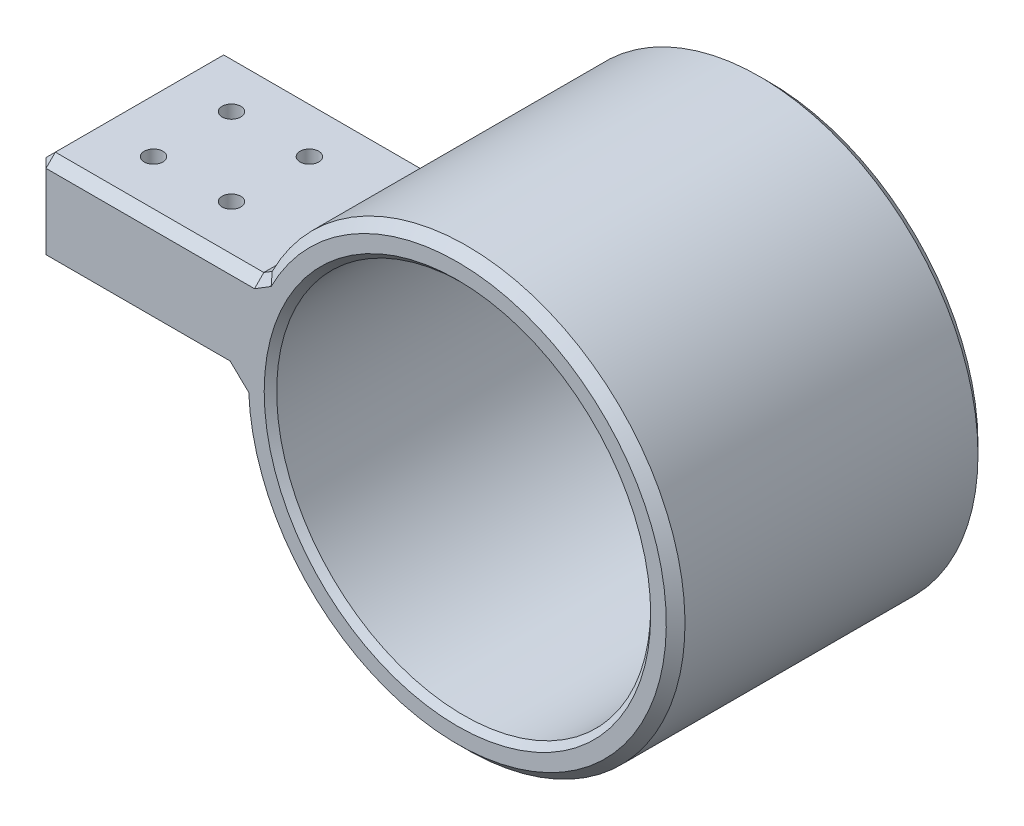
ISO-10303-21;
HEADER;
FILE_DESCRIPTION(('STEP AP214'),'2;1');
FILE_NAME('part.step','',(''),(''),'','','');
FILE_SCHEMA(('AUTOMOTIVE_DESIGN { 1 0 10303 214 1 1 1 1 }'));
ENDSEC;
DATA;
#1=APPLICATION_CONTEXT('core data for automotive mechanical design processes');
#2=APPLICATION_PROTOCOL_DEFINITION('international standard','automotive_design',2000,#1);
#3=PRODUCT_CONTEXT('',#1,'mechanical');
#4=PRODUCT('Part','Part','',(#3));
#5=PRODUCT_RELATED_PRODUCT_CATEGORY('part','',(#4));
#6=PRODUCT_DEFINITION_FORMATION('','',#4);
#7=PRODUCT_DEFINITION_CONTEXT('part definition',#1,'design');
#8=PRODUCT_DEFINITION('design','',#6,#7);
#9=PRODUCT_DEFINITION_SHAPE('','',#8);
#10=(LENGTH_UNIT() NAMED_UNIT(*) SI_UNIT(.MILLI.,.METRE.));
#11=(NAMED_UNIT(*) PLANE_ANGLE_UNIT() SI_UNIT($,.RADIAN.));
#12=(NAMED_UNIT(*) SI_UNIT($,.STERADIAN.) SOLID_ANGLE_UNIT());
#13=UNCERTAINTY_MEASURE_WITH_UNIT(LENGTH_MEASURE(1.E-05),#10,'distance_accuracy_value','');
#14=(GEOMETRIC_REPRESENTATION_CONTEXT(3) GLOBAL_UNCERTAINTY_ASSIGNED_CONTEXT((#13)) GLOBAL_UNIT_ASSIGNED_CONTEXT((#10,
#11,#12)) REPRESENTATION_CONTEXT('',''));
#15=CARTESIAN_POINT('',(0.,0.,0.));
#16=DIRECTION('',(0.,0.,1.));
#17=DIRECTION('',(1.,0.,0.));
#18=AXIS2_PLACEMENT_3D('',#15,#16,#17);
#19=CARTESIAN_POINT('',(0.,0.,-50.));
#20=DIRECTION('',(0.,0.,1.));
#21=DIRECTION('',(-1.,0.,0.));
#22=AXIS2_PLACEMENT_3D('',#19,#20,#21);
#23=CYLINDRICAL_SURFACE('',#22,35.);
#24=CARTESIAN_POINT('',(0.,0.,-48.5));
#25=DIRECTION('',(0.,0.,1.));
#26=DIRECTION('',(1.,0.,0.));
#27=AXIS2_PLACEMENT_3D('',#24,#25,#26);
#28=CIRCLE('',#27,35.);
#29=CARTESIAN_POINT('',(35.,0.,-48.5));
#30=VERTEX_POINT('',#29);
#31=EDGE_CURVE('E172',#30,#30,#28,.F.);
#32=ORIENTED_EDGE('',*,*,#31,.F.);
#33=EDGE_LOOP('',(#32));
#34=FACE_BOUND('',#33,.T.);
#35=DIRECTION('',(0.,0.,1.));
#36=VECTOR('',#35,1.);
#37=CARTESIAN_POINT('',(-31.2196559377255,15.8219178082192,-50.));
#38=LINE('',#37,#36);
#39=CARTESIAN_POINT('',(-31.2196559377255,15.8219178082192,-1.5));
#40=VERTEX_POINT('',#39);
#41=CARTESIAN_POINT('',(-31.2196559377255,15.8219178082192,-28.5));
#42=VERTEX_POINT('',#41);
#43=EDGE_CURVE('E162',#40,#42,#38,.F.);
#44=ORIENTED_EDGE('',*,*,#43,.F.);
#45=CARTESIAN_POINT('',(0.,0.,-1.5));
#46=DIRECTION('',(0.,0.,1.));
#47=DIRECTION('',(1.,0.,0.));
#48=AXIS2_PLACEMENT_3D('',#45,#46,#47);
#49=CIRCLE('',#48,35.);
#50=CARTESIAN_POINT('',(-34.9704322470338,-1.43835616438356,-1.5));
#51=VERTEX_POINT('',#50);
#52=EDGE_CURVE('E135',#51,#40,#49,.T.);
#53=ORIENTED_EDGE('',*,*,#52,.F.);
#54=DIRECTION('',(0.,0.,1.));
#55=VECTOR('',#54,1.);
#56=CARTESIAN_POINT('',(-34.9704322470338,-1.43835616438355,-50.));
#57=LINE('',#56,#55);
#58=CARTESIAN_POINT('',(-34.9704322470338,-1.43835616438356,-31.5));
#59=VERTEX_POINT('',#58);
#60=EDGE_CURVE('E154',#59,#51,#57,.T.);
#61=ORIENTED_EDGE('',*,*,#60,.F.);
#62=CARTESIAN_POINT('',(0.,0.,-31.5));
#63=DIRECTION('',(0.,0.,1.));
#64=DIRECTION('',(1.,0.,0.));
#65=AXIS2_PLACEMENT_3D('',#62,#63,#64);
#66=CIRCLE('',#65,35.);
#67=CARTESIAN_POINT('',(-32.518020467039,12.945205479452,-31.5));
#68=VERTEX_POINT('',#67);
#69=EDGE_CURVE('E158',#68,#59,#66,.T.);
#70=ORIENTED_EDGE('',*,*,#69,.F.);
#71=CARTESIAN_POINT('',(-32.518020467039,12.945205479452,-31.5));
#72=CARTESIAN_POINT('',(-32.4705173129702,13.0645316276012,-31.3720006531807));
#73=CARTESIAN_POINT('',(-32.4222557667148,13.1838528155139,-31.2442801791965));
#74=CARTESIAN_POINT('',(-32.3241816362658,13.4225156631757,-30.9894507002295));
#75=CARTESIAN_POINT('',(-32.2743690235219,13.5418573232613,-30.8623417065519));
#76=CARTESIAN_POINT('',(-32.1225517348467,13.8999617613975,-30.4820092355911));
#77=CARTESIAN_POINT('',(-32.0181714839425,14.1387942531903,-30.2297907348745));
#78=CARTESIAN_POINT('',(-31.8564808952528,14.4976502028595,-29.8538718835793));
#79=CARTESIAN_POINT('',(-31.8016887549302,14.6174578121394,-29.7288766405428));
#80=CARTESIAN_POINT('',(-31.6903462810003,14.8573023564548,-29.4799014768715));
#81=CARTESIAN_POINT('',(-31.633796013649,14.9773392826887,-29.3559215181972));
#82=CARTESIAN_POINT('',(-31.5188139382657,15.2178235133599,-29.1090813902841));
#83=CARTESIAN_POINT('',(-31.4603810609639,15.3382710149878,-28.9862219101428));
#84=CARTESIAN_POINT('',(-31.3415348071999,15.5796746361056,-28.7419541355256));
#85=CARTESIAN_POINT('',(-31.2811213134111,15.700630785355,-28.6205459276027));
#86=CARTESIAN_POINT('',(-31.2196559377255,15.8219178082192,-28.5));
#87=B_SPLINE_CURVE_WITH_KNOTS('',3,(#71,#72,#73,#74,#75,#76,#77,#78,#79,#80,#81,#82,#83,#84,#85,
#86),.UNSPECIFIED.,.F.,.F.,(4,2,2,2,2,2,2,4),(0.,0.543972994265221,1.08795600733076,
2.1759664751342,2.72076838902824,3.26554979657465,3.81064627730311,4.35577510666938),.UNSPECIFIED.);
#88=EDGE_CURVE('E46',#42,#68,#87,.F.);
#89=ORIENTED_EDGE('',*,*,#88,.F.);
#90=EDGE_LOOP('',(#44,#53,#61,#70,#89));
#91=FACE_BOUND('',#90,.T.);
#92=ADVANCED_FACE('F37',(#34,#91),#23,.T.);
#93=CARTESIAN_POINT('',(0.,0.,-50.));
#94=DIRECTION('',(0.,0.,-1.));
#95=DIRECTION('',(1.,0.,0.));
#96=AXIS2_PLACEMENT_3D('',#93,#94,#95);
#97=PLANE('',#96);
#98=CARTESIAN_POINT('',(0.,0.,-50.));
#99=DIRECTION('',(0.,0.,1.));
#100=DIRECTION('',(1.,0.,0.));
#101=AXIS2_PLACEMENT_3D('',#98,#99,#100);
#102=CIRCLE('',#101,33.5);
#103=CARTESIAN_POINT('',(33.5,0.,-50.));
#104=VERTEX_POINT('',#103);
#105=EDGE_CURVE('E163',#104,#104,#102,.T.);
#106=ORIENTED_EDGE('',*,*,#105,.F.);
#107=EDGE_LOOP('',(#106));
#108=FACE_BOUND('',#107,.T.);
#109=CARTESIAN_POINT('',(0.,0.,-50.));
#110=DIRECTION('',(0.,0.,1.));
#111=DIRECTION('',(1.,0.,0.));
#112=AXIS2_PLACEMENT_3D('',#109,#110,#111);
#113=CIRCLE('',#112,31.);
#114=CARTESIAN_POINT('',(31.,0.,-50.));
#115=VERTEX_POINT('',#114);
#116=EDGE_CURVE('E334',#115,#115,#113,.F.);
#117=ORIENTED_EDGE('',*,*,#116,.F.);
#118=EDGE_LOOP('',(#117));
#119=FACE_BOUND('',#118,.T.);
#120=ADVANCED_FACE('F320',(#108,#119),#97,.T.);
#121=CARTESIAN_POINT('',(0.,0.,0.));
#122=DIRECTION('',(0.,0.,-1.));
#123=DIRECTION('',(1.,0.,0.));
#124=AXIS2_PLACEMENT_3D('',#121,#122,#123);
#125=PLANE('',#124);
#126=DIRECTION('',(0.721490086699384,-0.692424764717811,0.));
#127=VECTOR('',#126,1.);
#128=CARTESIAN_POINT('',(-33.4716994364466,-1.37671232876712,0.));
#129=LINE('',#128,#127);
#130=CARTESIAN_POINT('',(-36.469165057621,1.5,0.));
#131=VERTEX_POINT('',#130);
#132=CARTESIAN_POINT('',(-33.4716994364466,-1.37671232876712,0.));
#133=VERTEX_POINT('',#132);
#134=EDGE_CURVE('E194',#131,#133,#129,.T.);
#135=ORIENTED_EDGE('',*,*,#134,.T.);
#136=CARTESIAN_POINT('',(0.,0.,0.));
#137=DIRECTION('',(0.,0.,1.));
#138=DIRECTION('',(1.,0.,0.));
#139=AXIS2_PLACEMENT_3D('',#136,#137,#138);
#140=CIRCLE('',#139,33.5);
#141=CARTESIAN_POINT('',(-29.8816706832515,15.1438356164383,0.));
#142=VERTEX_POINT('',#141);
#143=EDGE_CURVE('E138',#142,#133,#140,.F.);
#144=ORIENTED_EDGE('',*,*,#143,.F.);
#145=DIRECTION('',(-0.852072413155291,-0.523423922590208,0.));
#146=VECTOR('',#145,1.);
#147=CARTESIAN_POINT('',(-32.5576411921994,13.5,0.));
#148=LINE('',#147,#146);
#149=CARTESIAN_POINT('',(-32.5576411921994,13.5,0.));
#150=VERTEX_POINT('',#149);
#151=EDGE_CURVE('E197',#142,#150,#148,.T.);
#152=ORIENTED_EDGE('',*,*,#151,.T.);
#153=DIRECTION('',(1.,0.,0.));
#154=VECTOR('',#153,1.);
#155=CARTESIAN_POINT('',(-31.6227766016838,13.5,0.));
#156=LINE('',#155,#154);
#157=CARTESIAN_POINT('',(-66.,13.5,0.));
#158=VERTEX_POINT('',#157);
#159=EDGE_CURVE('E200',#158,#150,#156,.T.);
#160=ORIENTED_EDGE('',*,*,#159,.F.);
#161=DIRECTION('',(0.,1.,0.));
#162=VECTOR('',#161,1.);
#163=CARTESIAN_POINT('',(-66.,0.,0.));
#164=LINE('',#163,#162);
#165=CARTESIAN_POINT('',(-66.,1.5,0.));
#166=VERTEX_POINT('',#165);
#167=EDGE_CURVE('E203',#166,#158,#164,.T.);
#168=ORIENTED_EDGE('',*,*,#167,.F.);
#169=DIRECTION('',(-1.,0.,0.));
#170=VECTOR('',#169,1.);
#171=CARTESIAN_POINT('',(0.,1.5,0.));
#172=LINE('',#171,#170);
#173=EDGE_CURVE('E206',#131,#166,#172,.T.);
#174=ORIENTED_EDGE('',*,*,#173,.F.);
#175=EDGE_LOOP('',(#135,#144,#152,#160,#168,#174));
#176=FACE_BOUND('',#175,.T.);
#177=CARTESIAN_POINT('',(0.,0.,0.));
#178=DIRECTION('',(0.,0.,1.));
#179=DIRECTION('',(1.,0.,0.));
#180=AXIS2_PLACEMENT_3D('',#177,#178,#179);
#181=CIRCLE('',#180,31.);
#182=CARTESIAN_POINT('',(31.,0.,0.));
#183=VERTEX_POINT('',#182);
#184=EDGE_CURVE('E166',#183,#183,#181,.T.);
#185=ORIENTED_EDGE('',*,*,#184,.F.);
#186=EDGE_LOOP('',(#185));
#187=FACE_BOUND('',#186,.T.);
#188=ADVANCED_FACE('F325',(#176,#187),#125,.F.);
#189=CARTESIAN_POINT('',(0.,0.,-50.));
#190=DIRECTION('',(0.,0.,1.));
#191=DIRECTION('',(-1.,0.,0.));
#192=AXIS2_PLACEMENT_3D('',#189,#190,#191);
#193=CYLINDRICAL_SURFACE('',#192,30.);
#194=CARTESIAN_POINT('',(0.,0.,-49.));
#195=DIRECTION('',(0.,0.,1.));
#196=DIRECTION('',(1.,0.,0.));
#197=AXIS2_PLACEMENT_3D('',#194,#195,#196);
#198=CIRCLE('',#197,30.);
#199=CARTESIAN_POINT('',(30.,0.,-49.));
#200=VERTEX_POINT('',#199);
#201=EDGE_CURVE('E340',#200,#200,#198,.T.);
#202=ORIENTED_EDGE('',*,*,#201,.F.);
#203=EDGE_LOOP('',(#202));
#204=FACE_BOUND('',#203,.T.);
#205=CARTESIAN_POINT('',(0.,0.,-0.999999999999973));
#206=DIRECTION('',(0.,0.,1.));
#207=DIRECTION('',(1.,0.,0.));
#208=AXIS2_PLACEMENT_3D('',#205,#206,#207);
#209=CIRCLE('',#208,30.);
#210=CARTESIAN_POINT('',(30.,0.,-0.999999999999973));
#211=VERTEX_POINT('',#210);
#212=EDGE_CURVE('E336',#211,#211,#209,.F.);
#213=ORIENTED_EDGE('',*,*,#212,.F.);
#214=EDGE_LOOP('',(#213));
#215=FACE_BOUND('',#214,.T.);
#216=ADVANCED_FACE('F354',(#204,#215),#193,.F.);
#217=CARTESIAN_POINT('',(35.001,0.,-30.));
#218=DIRECTION('',(0.,0.,-1.));
#219=DIRECTION('',(1.,0.,0.));
#220=AXIS2_PLACEMENT_3D('',#217,#218,#219);
#221=PLANE('',#220);
#222=DIRECTION('',(-1.,0.,0.));
#223=VECTOR('',#222,1.);
#224=CARTESIAN_POINT('',(35.001,13.5,-30.));
#225=LINE('',#224,#223);
#226=CARTESIAN_POINT('',(-33.9116499156264,13.5,-30.));
#227=VERTEX_POINT('',#226);
#228=CARTESIAN_POINT('',(-66.,13.5,-30.));
#229=VERTEX_POINT('',#228);
#230=EDGE_CURVE('E221',#227,#229,#225,.T.);
#231=ORIENTED_EDGE('',*,*,#230,.F.);
#232=CARTESIAN_POINT('',(0.,0.,-30.));
#233=DIRECTION('',(0.,0.,1.));
#234=DIRECTION('',(1.,0.,0.));
#235=AXIS2_PLACEMENT_3D('',#232,#233,#234);
#236=CIRCLE('',#235,36.5);
#237=CARTESIAN_POINT('',(-36.5,0.,-30.));
#238=VERTEX_POINT('',#237);
#239=EDGE_CURVE('E218',#238,#227,#236,.F.);
#240=ORIENTED_EDGE('',*,*,#239,.F.);
#241=DIRECTION('',(1.,0.,0.));
#242=VECTOR('',#241,1.);
#243=CARTESIAN_POINT('',(-67.5,0.,-30.));
#244=LINE('',#243,#242);
#245=CARTESIAN_POINT('',(-66.,0.,-30.));
#246=VERTEX_POINT('',#245);
#247=EDGE_CURVE('E337',#246,#238,#244,.T.);
#248=ORIENTED_EDGE('',*,*,#247,.F.);
#249=DIRECTION('',(0.,-1.,0.));
#250=VECTOR('',#249,1.);
#251=CARTESIAN_POINT('',(-66.,0.,-30.));
#252=LINE('',#251,#250);
#253=EDGE_CURVE('E224',#229,#246,#252,.T.);
#254=ORIENTED_EDGE('',*,*,#253,.F.);
#255=EDGE_LOOP('',(#231,#240,#248,#254));
#256=FACE_BOUND('',#255,.T.);
#257=ADVANCED_FACE('F359',(#256),#221,.T.);
#258=CARTESIAN_POINT('',(35.001,15.,-30.));
#259=DIRECTION('',(0.,1.,0.));
#260=DIRECTION('',(0.,0.,-1.));
#261=AXIS2_PLACEMENT_3D('',#258,#259,#260);
#262=PLANE('',#261);
#263=DIRECTION('',(0.,0.,-1.));
#264=VECTOR('',#263,1.);
#265=CARTESIAN_POINT('',(-66.,15.,-30.));
#266=LINE('',#265,#264);
#267=CARTESIAN_POINT('',(-66.,15.,-1.5));
#268=VERTEX_POINT('',#267);
#269=CARTESIAN_POINT('',(-66.,15.,-28.5));
#270=VERTEX_POINT('',#269);
#271=EDGE_CURVE('E178',#268,#270,#266,.T.);
#272=ORIENTED_EDGE('',*,*,#271,.F.);
#273=DIRECTION('',(-1.,0.,0.));
#274=VECTOR('',#273,1.);
#275=CARTESIAN_POINT('',(-67.5,15.,-1.5));
#276=LINE('',#275,#274);
#277=CARTESIAN_POINT('',(-32.5576411921994,15.,-1.5));
#278=VERTEX_POINT('',#277);
#279=EDGE_CURVE('E175',#278,#268,#276,.T.);
#280=ORIENTED_EDGE('',*,*,#279,.F.);
#281=DIRECTION('',(0.,0.,1.));
#282=VECTOR('',#281,1.);
#283=CARTESIAN_POINT('',(-32.5576411921994,15.,-30.));
#284=LINE('',#283,#282);
#285=CARTESIAN_POINT('',(-32.5576411921994,15.,-28.5));
#286=VERTEX_POINT('',#285);
#287=EDGE_CURVE('E181',#286,#278,#284,.T.);
#288=ORIENTED_EDGE('',*,*,#287,.F.);
#289=DIRECTION('',(1.,0.,0.));
#290=VECTOR('',#289,1.);
#291=CARTESIAN_POINT('',(35.001,15.,-28.5));
#292=LINE('',#291,#290);
#293=EDGE_CURVE('E184',#270,#286,#292,.T.);
#294=ORIENTED_EDGE('',*,*,#293,.F.);
#295=EDGE_LOOP('',(#272,#280,#288,#294));
#296=FACE_BOUND('',#295,.T.);
#297=CARTESIAN_POINT('',(-57.5,15.,-21.25));
#298=DIRECTION('',(0.,-1.,0.));
#299=DIRECTION('',(0.,0.,-1.));
#300=AXIS2_PLACEMENT_3D('',#297,#298,#299);
#301=CIRCLE('',#300,1.5);
#302=CARTESIAN_POINT('',(-57.5,15.,-22.75));
#303=VERTEX_POINT('',#302);
#304=EDGE_CURVE('E422',#303,#303,#301,.T.);
#305=ORIENTED_EDGE('',*,*,#304,.T.);
#306=EDGE_LOOP('',(#305));
#307=FACE_BOUND('',#306,.T.);
#308=CARTESIAN_POINT('',(-45.,15.,-21.25));
#309=DIRECTION('',(0.,-1.,0.));
#310=DIRECTION('',(0.,0.,-1.));
#311=AXIS2_PLACEMENT_3D('',#308,#309,#310);
#312=CIRCLE('',#311,1.5);
#313=CARTESIAN_POINT('',(-45.,15.,-22.75));
#314=VERTEX_POINT('',#313);
#315=EDGE_CURVE('E419',#314,#314,#312,.T.);
#316=ORIENTED_EDGE('',*,*,#315,.T.);
#317=EDGE_LOOP('',(#316));
#318=FACE_BOUND('',#317,.T.);
#319=CARTESIAN_POINT('',(-45.,15.,-8.75));
#320=DIRECTION('',(0.,-1.,0.));
#321=DIRECTION('',(0.,0.,-1.));
#322=AXIS2_PLACEMENT_3D('',#319,#320,#321);
#323=CIRCLE('',#322,1.5);
#324=CARTESIAN_POINT('',(-45.,15.,-10.25));
#325=VERTEX_POINT('',#324);
#326=EDGE_CURVE('E399',#325,#325,#323,.T.);
#327=ORIENTED_EDGE('',*,*,#326,.T.);
#328=EDGE_LOOP('',(#327));
#329=FACE_BOUND('',#328,.T.);
#330=CARTESIAN_POINT('',(-57.5,15.,-8.74999999999999));
#331=DIRECTION('',(0.,-1.,0.));
#332=DIRECTION('',(0.,0.,-1.));
#333=AXIS2_PLACEMENT_3D('',#330,#331,#332);
#334=CIRCLE('',#333,1.5);
#335=CARTESIAN_POINT('',(-57.5,15.,-10.25));
#336=VERTEX_POINT('',#335);
#337=EDGE_CURVE('E408',#336,#336,#334,.T.);
#338=ORIENTED_EDGE('',*,*,#337,.T.);
#339=EDGE_LOOP('',(#338));
#340=FACE_BOUND('',#339,.T.);
#341=ADVANCED_FACE('F365',(#296,#307,#318,#329,#340),#262,.T.);
#342=CARTESIAN_POINT('',(-67.5,0.,-30.));
#343=DIRECTION('',(0.,1.,0.));
#344=DIRECTION('',(0.,0.,-1.));
#345=AXIS2_PLACEMENT_3D('',#342,#343,#344);
#346=PLANE('',#345);
#347=CARTESIAN_POINT('',(-57.5,0.,-21.25));
#348=DIRECTION('',(0.,1.,0.));
#349=DIRECTION('',(0.,0.,1.));
#350=AXIS2_PLACEMENT_3D('',#347,#348,#349);
#351=CIRCLE('',#350,1.5);
#352=CARTESIAN_POINT('',(-57.5,0.,-19.75));
#353=VERTEX_POINT('',#352);
#354=EDGE_CURVE('E411',#353,#353,#351,.T.);
#355=ORIENTED_EDGE('',*,*,#354,.T.);
#356=EDGE_LOOP('',(#355));
#357=FACE_BOUND('',#356,.T.);
#358=CARTESIAN_POINT('',(-45.,0.,-21.25));
#359=DIRECTION('',(0.,1.,0.));
#360=DIRECTION('',(0.,0.,1.));
#361=AXIS2_PLACEMENT_3D('',#358,#359,#360);
#362=CIRCLE('',#361,1.5);
#363=CARTESIAN_POINT('',(-45.,0.,-19.75));
#364=VERTEX_POINT('',#363);
#365=EDGE_CURVE('E405',#364,#364,#362,.T.);
#366=ORIENTED_EDGE('',*,*,#365,.T.);
#367=EDGE_LOOP('',(#366));
#368=FACE_BOUND('',#367,.T.);
#369=CARTESIAN_POINT('',(-45.,0.,-8.75));
#370=DIRECTION('',(0.,1.,0.));
#371=DIRECTION('',(0.,0.,1.));
#372=AXIS2_PLACEMENT_3D('',#369,#370,#371);
#373=CIRCLE('',#372,1.5);
#374=CARTESIAN_POINT('',(-45.,0.,-7.25));
#375=VERTEX_POINT('',#374);
#376=EDGE_CURVE('E402',#375,#375,#373,.T.);
#377=ORIENTED_EDGE('',*,*,#376,.T.);
#378=EDGE_LOOP('',(#377));
#379=FACE_BOUND('',#378,.T.);
#380=CARTESIAN_POINT('',(-57.5,0.,-8.75));
#381=DIRECTION('',(0.,1.,0.));
#382=DIRECTION('',(0.,0.,1.));
#383=AXIS2_PLACEMENT_3D('',#380,#381,#382);
#384=CIRCLE('',#383,1.5);
#385=CARTESIAN_POINT('',(-57.5,0.,-7.24999999999999));
#386=VERTEX_POINT('',#385);
#387=EDGE_CURVE('E404',#386,#386,#384,.T.);
#388=ORIENTED_EDGE('',*,*,#387,.T.);
#389=EDGE_LOOP('',(#388));
#390=FACE_BOUND('',#389,.T.);
#391=ORIENTED_EDGE('',*,*,#247,.T.);
#392=DIRECTION('',(0.707106781186551,0.,-0.707106781186544));
#393=VECTOR('',#392,1.);
#394=CARTESIAN_POINT('',(0.,0.,-66.4999999999997));
#395=LINE('',#394,#393);
#396=CARTESIAN_POINT('',(-36.469165057621,0.,-30.0308349423791));
#397=VERTEX_POINT('',#396);
#398=EDGE_CURVE('E11',#397,#238,#395,.F.);
#399=ORIENTED_EDGE('',*,*,#398,.F.);
#400=DIRECTION('',(0.,0.,-1.));
#401=VECTOR('',#400,1.);
#402=CARTESIAN_POINT('',(-36.469165057621,0.,-30.));
#403=LINE('',#402,#401);
#404=CARTESIAN_POINT('',(-36.469165057621,0.,-1.50000000000002));
#405=VERTEX_POINT('',#404);
#406=EDGE_CURVE('E187',#405,#397,#403,.T.);
#407=ORIENTED_EDGE('',*,*,#406,.F.);
#408=DIRECTION('',(1.,0.,0.));
#409=VECTOR('',#408,1.);
#410=CARTESIAN_POINT('',(-67.5,0.,-1.50000000000002));
#411=LINE('',#410,#409);
#412=CARTESIAN_POINT('',(-67.5,0.,-1.5));
#413=VERTEX_POINT('',#412);
#414=EDGE_CURVE('E189',#413,#405,#411,.T.);
#415=ORIENTED_EDGE('',*,*,#414,.F.);
#416=DIRECTION('',(0.,0.,-1.));
#417=VECTOR('',#416,1.);
#418=CARTESIAN_POINT('',(-67.5,0.,-30.));
#419=LINE('',#418,#417);
#420=CARTESIAN_POINT('',(-67.5,0.,-28.5));
#421=VERTEX_POINT('',#420);
#422=EDGE_CURVE('E343',#413,#421,#419,.T.);
#423=ORIENTED_EDGE('',*,*,#422,.T.);
#424=DIRECTION('',(-0.707106781186548,0.,0.707106781186548));
#425=VECTOR('',#424,1.);
#426=CARTESIAN_POINT('',(-67.5,0.,-28.5));
#427=LINE('',#426,#425);
#428=EDGE_CURVE('E191',#246,#421,#427,.T.);
#429=ORIENTED_EDGE('',*,*,#428,.F.);
#430=EDGE_LOOP('',(#391,#399,#407,#415,#423,#429));
#431=FACE_BOUND('',#430,.T.);
#432=ADVANCED_FACE('F369',(#357,#368,#379,#390,#431),#346,.F.);
#433=CARTESIAN_POINT('',(-67.5,0.,0.));
#434=DIRECTION('',(1.,0.,0.));
#435=DIRECTION('',(0.,0.,1.));
#436=AXIS2_PLACEMENT_3D('',#433,#434,#435);
#437=PLANE('',#436);
#438=ORIENTED_EDGE('',*,*,#422,.F.);
#439=DIRECTION('',(0.,-1.,0.));
#440=VECTOR('',#439,1.);
#441=CARTESIAN_POINT('',(-67.5,0.,-1.5));
#442=LINE('',#441,#440);
#443=CARTESIAN_POINT('',(-67.5,13.5,-1.5));
#444=VERTEX_POINT('',#443);
#445=EDGE_CURVE('E209',#444,#413,#442,.T.);
#446=ORIENTED_EDGE('',*,*,#445,.F.);
#447=DIRECTION('',(0.,0.,1.));
#448=VECTOR('',#447,1.);
#449=CARTESIAN_POINT('',(-67.5,13.5,0.));
#450=LINE('',#449,#448);
#451=CARTESIAN_POINT('',(-67.5,13.5,-28.5));
#452=VERTEX_POINT('',#451);
#453=EDGE_CURVE('E212',#452,#444,#450,.T.);
#454=ORIENTED_EDGE('',*,*,#453,.F.);
#455=DIRECTION('',(0.,1.,0.));
#456=VECTOR('',#455,1.);
#457=CARTESIAN_POINT('',(-67.5,15.,-28.5));
#458=LINE('',#457,#456);
#459=EDGE_CURVE('E215',#421,#452,#458,.T.);
#460=ORIENTED_EDGE('',*,*,#459,.F.);
#461=EDGE_LOOP('',(#438,#446,#454,#460));
#462=FACE_BOUND('',#461,.T.);
#463=ADVANCED_FACE('F373',(#462),#437,.F.);
#464=CARTESIAN_POINT('',(-57.5,35.,-8.74999999999999));
#465=DIRECTION('',(0.,-1.,0.));
#466=DIRECTION('',(0.,0.,1.));
#467=AXIS2_PLACEMENT_3D('',#464,#465,#466);
#468=CYLINDRICAL_SURFACE('',#467,1.5);
#469=ORIENTED_EDGE('',*,*,#337,.F.);
#470=EDGE_LOOP('',(#469));
#471=FACE_BOUND('',#470,.T.);
#472=ORIENTED_EDGE('',*,*,#387,.F.);
#473=EDGE_LOOP('',(#472));
#474=FACE_BOUND('',#473,.T.);
#475=ADVANCED_FACE('F377',(#471,#474),#468,.F.);
#476=CARTESIAN_POINT('',(-45.,35.,-8.75));
#477=DIRECTION('',(0.,-1.,0.));
#478=DIRECTION('',(0.,0.,1.));
#479=AXIS2_PLACEMENT_3D('',#476,#477,#478);
#480=CYLINDRICAL_SURFACE('',#479,1.5);
#481=ORIENTED_EDGE('',*,*,#326,.F.);
#482=EDGE_LOOP('',(#481));
#483=FACE_BOUND('',#482,.T.);
#484=ORIENTED_EDGE('',*,*,#376,.F.);
#485=EDGE_LOOP('',(#484));
#486=FACE_BOUND('',#485,.T.);
#487=ADVANCED_FACE('F381',(#483,#486),#480,.F.);
#488=CARTESIAN_POINT('',(-45.,35.,-21.25));
#489=DIRECTION('',(0.,-1.,0.));
#490=DIRECTION('',(0.,0.,1.));
#491=AXIS2_PLACEMENT_3D('',#488,#489,#490);
#492=CYLINDRICAL_SURFACE('',#491,1.5);
#493=ORIENTED_EDGE('',*,*,#315,.F.);
#494=EDGE_LOOP('',(#493));
#495=FACE_BOUND('',#494,.T.);
#496=ORIENTED_EDGE('',*,*,#365,.F.);
#497=EDGE_LOOP('',(#496));
#498=FACE_BOUND('',#497,.T.);
#499=ADVANCED_FACE('F387',(#495,#498),#492,.F.);
#500=CARTESIAN_POINT('',(-57.5,35.,-21.25));
#501=DIRECTION('',(0.,-1.,0.));
#502=DIRECTION('',(0.,0.,1.));
#503=AXIS2_PLACEMENT_3D('',#500,#501,#502);
#504=CYLINDRICAL_SURFACE('',#503,1.5);
#505=ORIENTED_EDGE('',*,*,#304,.F.);
#506=EDGE_LOOP('',(#505));
#507=FACE_BOUND('',#506,.T.);
#508=ORIENTED_EDGE('',*,*,#354,.F.);
#509=EDGE_LOOP('',(#508));
#510=FACE_BOUND('',#509,.T.);
#511=ADVANCED_FACE('F383',(#507,#510),#504,.F.);
#512=CARTESIAN_POINT('',(0.,0.,-50.));
#513=DIRECTION('',(0.,0.,-1.));
#514=DIRECTION('',(1.,0.,0.));
#515=AXIS2_PLACEMENT_3D('',#512,#513,#514);
#516=CONICAL_SURFACE('',#515,31.,0.785398163397443);
#517=ORIENTED_EDGE('',*,*,#201,.T.);
#518=EDGE_LOOP('',(#517));
#519=FACE_BOUND('',#518,.T.);
#520=ORIENTED_EDGE('',*,*,#116,.T.);
#521=EDGE_LOOP('',(#520));
#522=FACE_BOUND('',#521,.T.);
#523=ADVANCED_FACE('F386',(#519,#522),#516,.F.);
#524=CARTESIAN_POINT('',(0.,0.,-0.999999999999973));
#525=DIRECTION('',(0.,0.,1.));
#526=DIRECTION('',(-1.,0.,0.));
#527=AXIS2_PLACEMENT_3D('',#524,#525,#526);
#528=CONICAL_SURFACE('',#527,30.,0.785398163397457);
#529=ORIENTED_EDGE('',*,*,#184,.T.);
#530=EDGE_LOOP('',(#529));
#531=FACE_BOUND('',#530,.T.);
#532=ORIENTED_EDGE('',*,*,#212,.T.);
#533=EDGE_LOOP('',(#532));
#534=FACE_BOUND('',#533,.T.);
#535=ADVANCED_FACE('F243',(#531,#534),#528,.F.);
#536=CARTESIAN_POINT('',(0.,0.,-50.));
#537=DIRECTION('',(0.,0.,1.));
#538=DIRECTION('',(-1.,0.,0.));
#539=AXIS2_PLACEMENT_3D('',#536,#537,#538);
#540=CONICAL_SURFACE('',#539,33.5,0.785398163397444);
#541=ORIENTED_EDGE('',*,*,#31,.T.);
#542=EDGE_LOOP('',(#541));
#543=FACE_BOUND('',#542,.T.);
#544=ORIENTED_EDGE('',*,*,#105,.T.);
#545=EDGE_LOOP('',(#544));
#546=FACE_BOUND('',#545,.T.);
#547=ADVANCED_FACE('F244',(#543,#546),#540,.T.);
#548=CARTESIAN_POINT('',(-67.5,0.,-28.5));
#549=DIRECTION('',(-0.707106781186547,0.,-0.707106781186547));
#550=DIRECTION('',(0.,-1.,0.));
#551=AXIS2_PLACEMENT_3D('',#548,#549,#550);
#552=PLANE('',#551);
#553=ORIENTED_EDGE('',*,*,#428,.T.);
#554=ORIENTED_EDGE('',*,*,#459,.T.);
#555=DIRECTION('',(0.707106781186547,0.,-0.707106781186547));
#556=VECTOR('',#555,1.);
#557=CARTESIAN_POINT('',(-66.75,13.5,-29.25));
#558=LINE('',#557,#556);
#559=EDGE_CURVE('E434',#452,#229,#558,.T.);
#560=ORIENTED_EDGE('',*,*,#559,.T.);
#561=ORIENTED_EDGE('',*,*,#253,.T.);
#562=EDGE_LOOP('',(#553,#554,#560,#561));
#563=FACE_BOUND('',#562,.T.);
#564=ADVANCED_FACE('F39',(#563),#552,.T.);
#565=CARTESIAN_POINT('',(-67.5,13.5,0.));
#566=DIRECTION('',(-0.707106781186547,0.707106781186547,0.));
#567=DIRECTION('',(0.,0.,-1.));
#568=AXIS2_PLACEMENT_3D('',#565,#566,#567);
#569=PLANE('',#568);
#570=DIRECTION('',(0.707106781186547,0.707106781186547,0.));
#571=VECTOR('',#570,1.);
#572=CARTESIAN_POINT('',(-67.5,13.5,-1.5));
#573=LINE('',#572,#571);
#574=EDGE_CURVE('E457',#444,#268,#573,.T.);
#575=ORIENTED_EDGE('',*,*,#574,.T.);
#576=ORIENTED_EDGE('',*,*,#271,.T.);
#577=DIRECTION('',(-0.707106781186548,-0.707106781186548,0.));
#578=VECTOR('',#577,1.);
#579=CARTESIAN_POINT('',(-66.,15.,-28.5));
#580=LINE('',#579,#578);
#581=EDGE_CURVE('E462',#270,#452,#580,.T.);
#582=ORIENTED_EDGE('',*,*,#581,.T.);
#583=ORIENTED_EDGE('',*,*,#453,.T.);
#584=EDGE_LOOP('',(#575,#576,#582,#583));
#585=FACE_BOUND('',#584,.T.);
#586=ADVANCED_FACE('F469',(#585),#569,.T.);
#587=CARTESIAN_POINT('',(-67.5,0.,-1.5));
#588=DIRECTION('',(0.707106781186544,0.,-0.707106781186551));
#589=DIRECTION('',(0.,-1.,0.));
#590=AXIS2_PLACEMENT_3D('',#587,#588,#589);
#591=PLANE('',#590);
#592=DIRECTION('',(0.707106781186551,0.,0.707106781186544));
#593=VECTOR('',#592,1.);
#594=CARTESIAN_POINT('',(-67.5,13.5,-1.5));
#595=LINE('',#594,#593);
#596=EDGE_CURVE('E456',#158,#444,#595,.F.);
#597=ORIENTED_EDGE('',*,*,#596,.T.);
#598=ORIENTED_EDGE('',*,*,#445,.T.);
#599=DIRECTION('',(-0.577350269189631,-0.57735026918962,-0.577350269189626));
#600=VECTOR('',#599,1.);
#601=CARTESIAN_POINT('',(-67.5,0.,-1.5));
#602=LINE('',#601,#600);
#603=EDGE_CURVE('E41',#413,#166,#602,.F.);
#604=ORIENTED_EDGE('',*,*,#603,.T.);
#605=ORIENTED_EDGE('',*,*,#167,.T.);
#606=EDGE_LOOP('',(#597,#598,#604,#605));
#607=FACE_BOUND('',#606,.T.);
#608=ADVANCED_FACE('F464',(#607),#591,.F.);
#609=CARTESIAN_POINT('',(-67.5,0.,-1.50000000000002));
#610=DIRECTION('',(0.,0.707106781186551,-0.707106781186544));
#611=DIRECTION('',(1.,0.,0.));
#612=AXIS2_PLACEMENT_3D('',#609,#610,#611);
#613=PLANE('',#612);
#614=ORIENTED_EDGE('',*,*,#603,.F.);
#615=ORIENTED_EDGE('',*,*,#414,.T.);
#616=DIRECTION('',(0.,0.707106781186544,0.707106781186551));
#617=VECTOR('',#616,1.);
#618=CARTESIAN_POINT('',(-36.469165057621,0.,-1.50000000000002));
#619=LINE('',#618,#617);
#620=EDGE_CURVE('E149',#405,#131,#619,.T.);
#621=ORIENTED_EDGE('',*,*,#620,.T.);
#622=ORIENTED_EDGE('',*,*,#173,.T.);
#623=EDGE_LOOP('',(#614,#615,#621,#622));
#624=FACE_BOUND('',#623,.T.);
#625=ADVANCED_FACE('F301',(#624),#613,.F.);
#626=CARTESIAN_POINT('',(-36.469165057621,0.,-50.));
#627=DIRECTION('',(-0.692424764717811,-0.721490086699384,0.));
#628=DIRECTION('',(0.,0.,1.));
#629=AXIS2_PLACEMENT_3D('',#626,#627,#628);
#630=PLANE('',#629);
#631=CARTESIAN_POINT('',(-34.9704322470338,-1.43835616438356,-31.5));
#632=CARTESIAN_POINT('',(-35.096203299304,-1.31765181531218,-31.3792951852957));
#633=CARTESIAN_POINT('',(-35.2217456049854,-1.19716699774353,-31.2581329054924));
#634=CARTESIAN_POINT('',(-35.4723848392769,-0.956624797604228,-31.0149351776933));
#635=CARTESIAN_POINT('',(-35.5974817782609,-0.836567405077673,-30.8928997502374));
#636=CARTESIAN_POINT('',(-35.847248111254,-0.596862941294404,-30.6479920021526));
#637=CARTESIAN_POINT('',(-35.9719175058811,-0.477215869444736,-30.5251196827339));
#638=CARTESIAN_POINT('',(-36.2208461047521,-0.238315391555497,-30.2785708359361));
#639=CARTESIAN_POINT('',(-36.3451052993099,-0.119061994811972,-30.1548942897684));
#640=CARTESIAN_POINT('',(-36.469165057621,0.,-30.0308349423791));
#641=B_SPLINE_CURVE_WITH_KNOTS('',3,(#631,#632,#633,#634,#635,#636,#637,#638,#639,#640),
.UNSPECIFIED.,.F.,.F.,(4,2,2,2,4),(0.,0.636094794521418,1.27217467442864,1.90825363474946,
2.54434750919141),.UNSPECIFIED.);
#642=EDGE_CURVE('E53',#397,#59,#641,.F.);
#643=ORIENTED_EDGE('',*,*,#642,.T.);
#644=ORIENTED_EDGE('',*,*,#60,.T.);
#645=DIRECTION('',(0.721490086699384,-0.692424764717811,0.));
#646=VECTOR('',#645,1.);
#647=CARTESIAN_POINT('',(-34.9704322470338,-1.43835616438356,-1.5));
#648=LINE('',#647,#646);
#649=EDGE_CURVE('E146',#51,#405,#648,.F.);
#650=ORIENTED_EDGE('',*,*,#649,.T.);
#651=ORIENTED_EDGE('',*,*,#406,.T.);
#652=EDGE_LOOP('',(#643,#644,#650,#651));
#653=FACE_BOUND('',#652,.T.);
#654=ADVANCED_FACE('F155',(#653),#630,.T.);
#655=CARTESIAN_POINT('',(-66.,15.,-28.5));
#656=DIRECTION('',(-0.577350269189624,0.577350269189629,-0.577350269189624));
#657=DIRECTION('',(0.,-0.707106781186544,-0.707106781186551));
#658=AXIS2_PLACEMENT_3D('',#655,#656,#657);
#659=PLANE('',#658);
#660=ORIENTED_EDGE('',*,*,#581,.F.);
#661=DIRECTION('',(0.,-0.707106781186544,-0.707106781186551));
#662=VECTOR('',#661,1.);
#663=CARTESIAN_POINT('',(-66.,15.,-28.5));
#664=LINE('',#663,#662);
#665=EDGE_CURVE('E61',#270,#229,#664,.T.);
#666=ORIENTED_EDGE('',*,*,#665,.T.);
#667=ORIENTED_EDGE('',*,*,#559,.F.);
#668=EDGE_LOOP('',(#660,#666,#667));
#669=FACE_BOUND('',#668,.T.);
#670=ADVANCED_FACE('F300',(#669),#659,.T.);
#671=CARTESIAN_POINT('',(-67.5,13.5,-1.5));
#672=DIRECTION('',(-0.577350269189623,0.577350269189623,0.577350269189633));
#673=DIRECTION('',(-0.707106781186554,0.,-0.707106781186541));
#674=AXIS2_PLACEMENT_3D('',#671,#672,#673);
#675=PLANE('',#674);
#676=ORIENTED_EDGE('',*,*,#596,.F.);
#677=DIRECTION('',(0.,-0.70710678118655,0.707106781186545));
#678=VECTOR('',#677,1.);
#679=CARTESIAN_POINT('',(-66.,14.25,-0.750000000000008));
#680=LINE('',#679,#678);
#681=EDGE_CURVE('E142',#158,#268,#680,.F.);
#682=ORIENTED_EDGE('',*,*,#681,.T.);
#683=ORIENTED_EDGE('',*,*,#574,.F.);
#684=EDGE_LOOP('',(#676,#682,#683));
#685=FACE_BOUND('',#684,.T.);
#686=ADVANCED_FACE('F467',(#685),#675,.T.);
#687=CARTESIAN_POINT('',(-34.9704322470338,-1.43835616438356,-1.5));
#688=DIRECTION('',(-0.561529442963869,-0.585100284004667,0.58510028400467));
#689=DIRECTION('',(0.,0.707106781186549,0.707106781186546));
#690=AXIS2_PLACEMENT_3D('',#687,#688,#689);
#691=PLANE('',#690);
#692=ORIENTED_EDGE('',*,*,#620,.F.);
#693=ORIENTED_EDGE('',*,*,#649,.F.);
#694=DIRECTION('',(-0.70650942236864,-0.0290591827884883,-0.707106781186544));
#695=VECTOR('',#694,1.);
#696=CARTESIAN_POINT('',(-33.4716994364466,-1.37671232876712,0.));
#697=LINE('',#696,#695);
#698=EDGE_CURVE('E131',#51,#133,#697,.F.);
#699=ORIENTED_EDGE('',*,*,#698,.T.);
#700=ORIENTED_EDGE('',*,*,#134,.F.);
#701=EDGE_LOOP('',(#692,#693,#699,#700));
#702=FACE_BOUND('',#701,.T.);
#703=ADVANCED_FACE('F148',(#702),#691,.T.);
#704=CARTESIAN_POINT('',(0.,0.,-30.));
#705=DIRECTION('',(0.,0.,1.));
#706=DIRECTION('',(-1.,0.,0.));
#707=AXIS2_PLACEMENT_3D('',#704,#705,#706);
#708=CONICAL_SURFACE('',#707,36.5,0.785398163397453);
#709=ORIENTED_EDGE('',*,*,#642,.F.);
#710=ORIENTED_EDGE('',*,*,#398,.T.);
#711=ORIENTED_EDGE('',*,*,#239,.T.);
#712=DIRECTION('',(0.656963222371608,-0.261532645096396,-0.707106781186544));
#713=VECTOR('',#712,1.);
#714=CARTESIAN_POINT('',(-33.9116499156264,13.5,-30.));
#715=LINE('',#714,#713);
#716=EDGE_CURVE('E143',#227,#68,#715,.T.);
#717=ORIENTED_EDGE('',*,*,#716,.T.);
#718=ORIENTED_EDGE('',*,*,#69,.T.);
#719=EDGE_LOOP('',(#709,#710,#711,#717,#718));
#720=FACE_BOUND('',#719,.T.);
#721=ADVANCED_FACE('F294',(#720),#708,.T.);
#722=CARTESIAN_POINT('',(35.001,13.5,-30.));
#723=DIRECTION('',(0.,-0.707106781186551,0.707106781186544));
#724=DIRECTION('',(-1.,0.,0.));
#725=AXIS2_PLACEMENT_3D('',#722,#723,#724);
#726=PLANE('',#725);
#727=ORIENTED_EDGE('',*,*,#665,.F.);
#728=ORIENTED_EDGE('',*,*,#293,.T.);
#729=CARTESIAN_POINT('',(-32.5576411921994,15.,-28.5));
#730=CARTESIAN_POINT('',(-32.6951545898115,14.8476596990482,-28.6523403009518));
#731=CARTESIAN_POINT('',(-32.8326679874237,14.6953193980965,-28.8046806019035));
#732=CARTESIAN_POINT('',(-33.1076947826479,14.3906387961929,-29.1093612038071));
#733=CARTESIAN_POINT('',(-33.2452081802601,14.2382984952411,-29.2617015047589));
#734=CARTESIAN_POINT('',(-33.5590310237902,13.8906387961929,-29.6093612038071));
#735=CARTESIAN_POINT('',(-33.7353404697083,13.6953193980964,-29.8046806019035));
#736=CARTESIAN_POINT('',(-33.9116499156264,13.5,-30.));
#737=B_SPLINE_CURVE_WITH_KNOTS('',3,(#729,#730,#731,#732,#733,#734,#735,#736),.UNSPECIFIED.,.F.,
.F.,(4,2,2,4),(0.,0.766763080748457,1.53352616149691,2.51661272807644),.UNSPECIFIED.);
#738=EDGE_CURVE('E275',#286,#227,#737,.T.);
#739=ORIENTED_EDGE('',*,*,#738,.T.);
#740=ORIENTED_EDGE('',*,*,#230,.T.);
#741=EDGE_LOOP('',(#727,#728,#739,#740));
#742=FACE_BOUND('',#741,.T.);
#743=ADVANCED_FACE('F266',(#742),#726,.F.);
#744=CARTESIAN_POINT('',(35.001,15.,-1.5));
#745=DIRECTION('',(0.,0.707106781186545,0.70710678118655));
#746=DIRECTION('',(1.,0.,0.));
#747=AXIS2_PLACEMENT_3D('',#744,#745,#746);
#748=PLANE('',#747);
#749=ORIENTED_EDGE('',*,*,#681,.F.);
#750=ORIENTED_EDGE('',*,*,#159,.T.);
#751=DIRECTION('',(0.,0.70710678118655,-0.707106781186545));
#752=VECTOR('',#751,1.);
#753=CARTESIAN_POINT('',(-32.5576411921994,13.5,0.));
#754=LINE('',#753,#752);
#755=EDGE_CURVE('E282',#150,#278,#754,.T.);
#756=ORIENTED_EDGE('',*,*,#755,.T.);
#757=ORIENTED_EDGE('',*,*,#279,.T.);
#758=EDGE_LOOP('',(#749,#750,#756,#757));
#759=FACE_BOUND('',#758,.T.);
#760=ADVANCED_FACE('F302',(#759),#748,.T.);
#761=CARTESIAN_POINT('',(0.,0.,-1.5));
#762=DIRECTION('',(0.,0.,-1.));
#763=DIRECTION('',(1.,0.,0.));
#764=AXIS2_PLACEMENT_3D('',#761,#762,#763);
#765=CONICAL_SURFACE('',#764,35.,0.785398163397453);
#766=ORIENTED_EDGE('',*,*,#698,.F.);
#767=ORIENTED_EDGE('',*,*,#52,.T.);
#768=DIRECTION('',(0.63073229771076,-0.319651010673372,0.707106781186545));
#769=VECTOR('',#768,1.);
#770=CARTESIAN_POINT('',(-31.2196559377255,15.8219178082192,-1.5));
#771=LINE('',#770,#769);
#772=EDGE_CURVE('E448',#40,#142,#771,.T.);
#773=ORIENTED_EDGE('',*,*,#772,.T.);
#774=ORIENTED_EDGE('',*,*,#143,.T.);
#775=EDGE_LOOP('',(#766,#767,#773,#774));
#776=FACE_BOUND('',#775,.T.);
#777=ADVANCED_FACE('F133',(#776),#765,.T.);
#778=CARTESIAN_POINT('',(-32.5576411921994,15.,-28.5));
#779=CARTESIAN_POINT('',(-33.9116499156264,13.5,-30.));
#780=CARTESIAN_POINT('',(-31.2196559377255,15.8219178082192,-28.5));
#781=CARTESIAN_POINT('',(-32.518020467039,12.945205479452,-31.5));
#782=B_SPLINE_SURFACE_WITH_KNOTS('',1,1,((#778,#779),(#780,#781)),.UNSPECIFIED.,.F.,.F.,.F.,(2,
2),(2,2),(0.,1.),(0.,1.),.UNSPECIFIED.);
#783=DIRECTION('',(-0.852072413155288,-0.523423922590212,0.));
#784=VECTOR('',#783,1.);
#785=CARTESIAN_POINT('',(-31.2196559377255,15.8219178082192,-28.5));
#786=LINE('',#785,#784);
#787=EDGE_CURVE('E442',#286,#42,#786,.F.);
#788=ORIENTED_EDGE('',*,*,#716,.F.);
#789=ORIENTED_EDGE('',*,*,#738,.F.);
#790=ORIENTED_EDGE('',*,*,#787,.T.);
#791=ORIENTED_EDGE('',*,*,#88,.T.);
#792=EDGE_LOOP('',(#788,#789,#790,#791));
#793=FACE_BOUND('',#792,.T.);
#794=ADVANCED_FACE('F260',(#793),#782,.T.);
#795=CARTESIAN_POINT('',(-32.5576411921994,15.,-1.5));
#796=DIRECTION('',(-0.398409536444791,0.648563736756011,0.648563736756016));
#797=DIRECTION('',(0.,0.70710678118655,-0.707106781186545));
#798=AXIS2_PLACEMENT_3D('',#795,#796,#797);
#799=PLANE('',#798);
#800=ORIENTED_EDGE('',*,*,#151,.F.);
#801=ORIENTED_EDGE('',*,*,#772,.F.);
#802=DIRECTION('',(0.852072413155291,0.523423922590208,0.));
#803=VECTOR('',#802,1.);
#804=CARTESIAN_POINT('',(-32.5576411921994,15.,-1.5));
#805=LINE('',#804,#803);
#806=EDGE_CURVE('E443',#40,#278,#805,.F.);
#807=ORIENTED_EDGE('',*,*,#806,.T.);
#808=ORIENTED_EDGE('',*,*,#755,.F.);
#809=EDGE_LOOP('',(#800,#801,#807,#808));
#810=FACE_BOUND('',#809,.T.);
#811=ADVANCED_FACE('F256',(#810),#799,.T.);
#812=CARTESIAN_POINT('',(-32.5576411921994,15.,-50.));
#813=DIRECTION('',(0.523423922590208,-0.852072413155291,0.));
#814=DIRECTION('',(0.,0.,1.));
#815=AXIS2_PLACEMENT_3D('',#812,#813,#814);
#816=PLANE('',#815);
#817=ORIENTED_EDGE('',*,*,#787,.F.);
#818=ORIENTED_EDGE('',*,*,#287,.T.);
#819=ORIENTED_EDGE('',*,*,#806,.F.);
#820=ORIENTED_EDGE('',*,*,#43,.T.);
#821=EDGE_LOOP('',(#817,#818,#819,#820));
#822=FACE_BOUND('',#821,.T.);
#823=ADVANCED_FACE('F253',(#822),#816,.F.);
#824=CLOSED_SHELL('',(#92,#120,#188,#216,#257,#341,#432,#463,#475,#487,#499,#511,#523,#535,#547,
#564,#586,#608,#625,#654,#670,#686,#703,#721,#743,#760,#777,#794,#811,#823));
#825=MANIFOLD_SOLID_BREP('B2',#824);
#826=ADVANCED_BREP_SHAPE_REPRESENTATION('',(#18,#825),#14);
#827=SHAPE_DEFINITION_REPRESENTATION(#9,#826);
ENDSEC;
END-ISO-10303-21;
